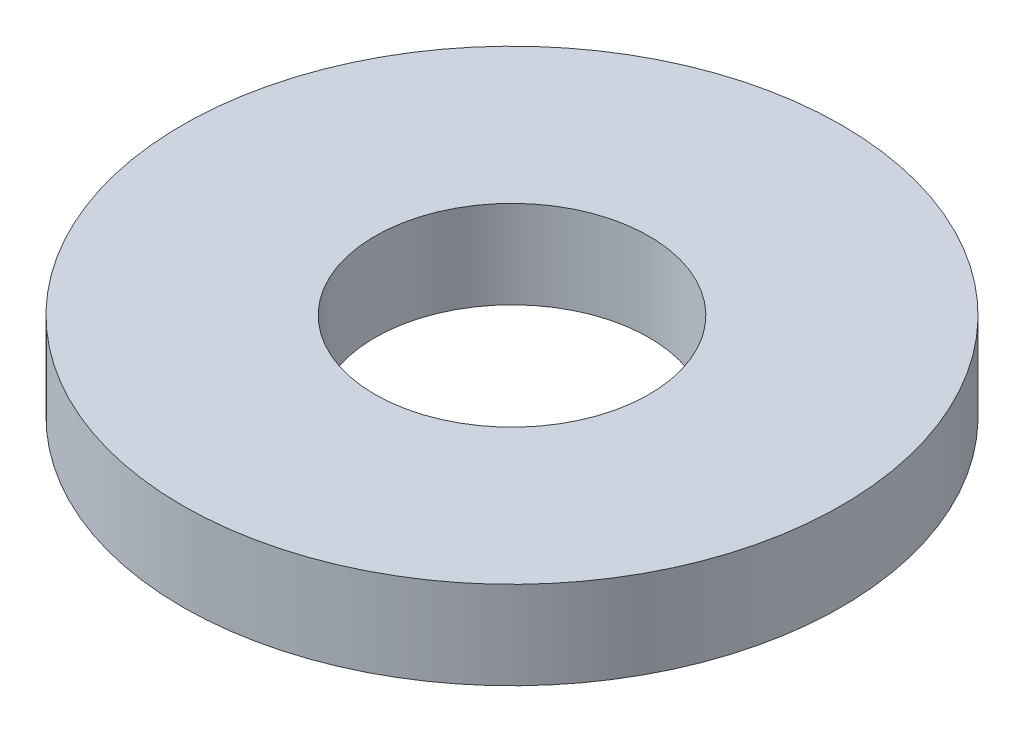
ISO-10303-21;
HEADER;
FILE_DESCRIPTION(('STEP AP214'),'2;1');
FILE_NAME('part.step','',(''),(''),'','','');
FILE_SCHEMA(('AUTOMOTIVE_DESIGN { 1 0 10303 214 1 1 1 1 }'));
ENDSEC;
DATA;
#1=APPLICATION_CONTEXT('core data for automotive mechanical design processes');
#2=APPLICATION_PROTOCOL_DEFINITION('international standard','automotive_design',2000,#1);
#3=PRODUCT_CONTEXT('',#1,'mechanical');
#4=PRODUCT('Part','Part','',(#3));
#5=PRODUCT_RELATED_PRODUCT_CATEGORY('part','',(#4));
#6=PRODUCT_DEFINITION_FORMATION('','',#4);
#7=PRODUCT_DEFINITION_CONTEXT('part definition',#1,'design');
#8=PRODUCT_DEFINITION('design','',#6,#7);
#9=PRODUCT_DEFINITION_SHAPE('','',#8);
#10=(LENGTH_UNIT() NAMED_UNIT(*) SI_UNIT(.MILLI.,.METRE.));
#11=(NAMED_UNIT(*) PLANE_ANGLE_UNIT() SI_UNIT($,.RADIAN.));
#12=(NAMED_UNIT(*) SI_UNIT($,.STERADIAN.) SOLID_ANGLE_UNIT());
#13=UNCERTAINTY_MEASURE_WITH_UNIT(LENGTH_MEASURE(1.E-05),#10,'distance_accuracy_value','');
#14=(GEOMETRIC_REPRESENTATION_CONTEXT(3) GLOBAL_UNCERTAINTY_ASSIGNED_CONTEXT((#13)) GLOBAL_UNIT_ASSIGNED_CONTEXT((#10,
#11,#12)) REPRESENTATION_CONTEXT('',''));
#15=CARTESIAN_POINT('',(0.,0.,0.));
#16=DIRECTION('',(0.,0.,1.));
#17=DIRECTION('',(1.,0.,0.));
#18=AXIS2_PLACEMENT_3D('',#15,#16,#17);
#19=CARTESIAN_POINT('',(0.,0.635,0.));
#20=DIRECTION('',(0.,-1.,0.));
#21=DIRECTION('',(0.,0.,-1.));
#22=AXIS2_PLACEMENT_3D('',#19,#20,#21);
#23=CYLINDRICAL_SURFACE('',#22,2.38125);
#24=CARTESIAN_POINT('',(0.,0.635,0.));
#25=DIRECTION('',(0.,1.,0.));
#26=DIRECTION('',(0.,0.,1.));
#27=AXIS2_PLACEMENT_3D('',#24,#25,#26);
#28=CIRCLE('',#27,2.38125);
#29=CARTESIAN_POINT('',(0.,0.635,2.38125));
#30=VERTEX_POINT('',#29);
#31=EDGE_CURVE('E10',#30,#30,#28,.T.);
#32=ORIENTED_EDGE('',*,*,#31,.F.);
#33=EDGE_LOOP('',(#32));
#34=FACE_BOUND('',#33,.T.);
#35=CARTESIAN_POINT('',(0.,0.,0.));
#36=DIRECTION('',(0.,1.,0.));
#37=DIRECTION('',(0.,0.,1.));
#38=AXIS2_PLACEMENT_3D('',#35,#36,#37);
#39=CIRCLE('',#38,2.38125);
#40=CARTESIAN_POINT('',(0.,0.,2.38125));
#41=VERTEX_POINT('',#40);
#42=EDGE_CURVE('E33',#41,#41,#39,.T.);
#43=ORIENTED_EDGE('',*,*,#42,.T.);
#44=EDGE_LOOP('',(#43));
#45=FACE_BOUND('',#44,.T.);
#46=ADVANCED_FACE('F30',(#34,#45),#23,.T.);
#47=CARTESIAN_POINT('',(0.,0.635,0.));
#48=DIRECTION('',(0.,1.,0.));
#49=DIRECTION('',(0.,0.,1.));
#50=AXIS2_PLACEMENT_3D('',#47,#48,#49);
#51=PLANE('',#50);
#52=CARTESIAN_POINT('',(0.,0.635,0.));
#53=DIRECTION('',(0.,1.,0.));
#54=DIRECTION('',(0.,0.,1.));
#55=AXIS2_PLACEMENT_3D('',#52,#53,#54);
#56=CIRCLE('',#55,0.9906);
#57=CARTESIAN_POINT('',(0.,0.635,0.9906));
#58=VERTEX_POINT('',#57);
#59=EDGE_CURVE('E42',#58,#58,#56,.T.);
#60=ORIENTED_EDGE('',*,*,#59,.F.);
#61=EDGE_LOOP('',(#60));
#62=FACE_BOUND('',#61,.T.);
#63=ORIENTED_EDGE('',*,*,#31,.T.);
#64=EDGE_LOOP('',(#63));
#65=FACE_BOUND('',#64,.T.);
#66=ADVANCED_FACE('F57',(#62,#65),#51,.T.);
#67=CARTESIAN_POINT('',(0.,0.,0.));
#68=DIRECTION('',(0.,1.,0.));
#69=DIRECTION('',(0.,0.,1.));
#70=AXIS2_PLACEMENT_3D('',#67,#68,#69);
#71=PLANE('',#70);
#72=CARTESIAN_POINT('',(0.,0.,0.));
#73=DIRECTION('',(0.,1.,0.));
#74=DIRECTION('',(0.,0.,1.));
#75=AXIS2_PLACEMENT_3D('',#72,#73,#74);
#76=CIRCLE('',#75,0.9906);
#77=CARTESIAN_POINT('',(0.,0.,0.9906));
#78=VERTEX_POINT('',#77);
#79=EDGE_CURVE('E40',#78,#78,#76,.T.);
#80=ORIENTED_EDGE('',*,*,#79,.T.);
#81=EDGE_LOOP('',(#80));
#82=FACE_BOUND('',#81,.T.);
#83=ORIENTED_EDGE('',*,*,#42,.F.);
#84=EDGE_LOOP('',(#83));
#85=FACE_BOUND('',#84,.T.);
#86=ADVANCED_FACE('F48',(#82,#85),#71,.F.);
#87=CARTESIAN_POINT('',(0.,0.,0.));
#88=DIRECTION('',(0.,1.,0.));
#89=DIRECTION('',(0.,0.,1.));
#90=AXIS2_PLACEMENT_3D('',#87,#88,#89);
#91=CYLINDRICAL_SURFACE('',#90,0.9906);
#92=ORIENTED_EDGE('',*,*,#79,.F.);
#93=EDGE_LOOP('',(#92));
#94=FACE_BOUND('',#93,.T.);
#95=ORIENTED_EDGE('',*,*,#59,.T.);
#96=EDGE_LOOP('',(#95));
#97=FACE_BOUND('',#96,.T.);
#98=ADVANCED_FACE('F51',(#94,#97),#91,.F.);
#99=CLOSED_SHELL('',(#46,#66,#86,#98));
#100=MANIFOLD_SOLID_BREP('B2',#99);
#101=ADVANCED_BREP_SHAPE_REPRESENTATION('',(#18,#100),#14);
#102=SHAPE_DEFINITION_REPRESENTATION(#9,#101);
ENDSEC;
END-ISO-10303-21;
